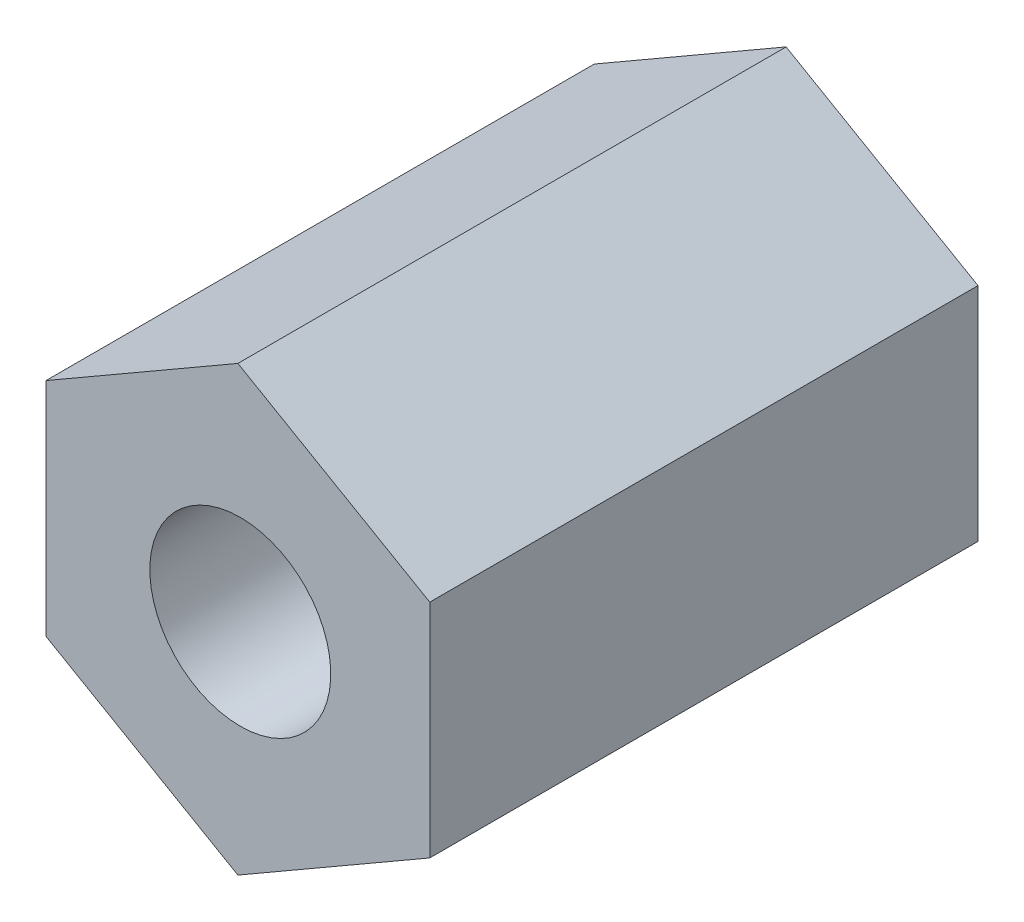
ISO-10303-21;
HEADER;
FILE_DESCRIPTION(('STEP AP214'),'2;1');
FILE_NAME('part.step','',(''),(''),'','','');
FILE_SCHEMA(('AUTOMOTIVE_DESIGN { 1 0 10303 214 1 1 1 1 }'));
ENDSEC;
DATA;
#1=APPLICATION_CONTEXT('core data for automotive mechanical design processes');
#2=APPLICATION_PROTOCOL_DEFINITION('international standard','automotive_design',2000,#1);
#3=PRODUCT_CONTEXT('',#1,'mechanical');
#4=PRODUCT('Part','Part','',(#3));
#5=PRODUCT_RELATED_PRODUCT_CATEGORY('part','',(#4));
#6=PRODUCT_DEFINITION_FORMATION('','',#4);
#7=PRODUCT_DEFINITION_CONTEXT('part definition',#1,'design');
#8=PRODUCT_DEFINITION('design','',#6,#7);
#9=PRODUCT_DEFINITION_SHAPE('','',#8);
#10=(LENGTH_UNIT() NAMED_UNIT(*) SI_UNIT(.MILLI.,.METRE.));
#11=(NAMED_UNIT(*) PLANE_ANGLE_UNIT() SI_UNIT($,.RADIAN.));
#12=(NAMED_UNIT(*) SI_UNIT($,.STERADIAN.) SOLID_ANGLE_UNIT());
#13=UNCERTAINTY_MEASURE_WITH_UNIT(LENGTH_MEASURE(1.E-05),#10,'distance_accuracy_value','');
#14=(GEOMETRIC_REPRESENTATION_CONTEXT(3) GLOBAL_UNCERTAINTY_ASSIGNED_CONTEXT((#13)) GLOBAL_UNIT_ASSIGNED_CONTEXT((#10,
#11,#12)) REPRESENTATION_CONTEXT('',''));
#15=CARTESIAN_POINT('',(0.,0.,0.));
#16=DIRECTION('',(0.,0.,1.));
#17=DIRECTION('',(1.,0.,0.));
#18=AXIS2_PLACEMENT_3D('',#15,#16,#17);
#19=CARTESIAN_POINT('',(-3.5,-4.089949307,0.));
#20=DIRECTION('',(0.,0.,1.));
#21=DIRECTION('',(1.,0.,0.));
#22=AXIS2_PLACEMENT_3D('',#19,#20,#21);
#23=PLANE('',#22);
#24=CARTESIAN_POINT('',(0.043884597,-0.0180420660000053,0.));
#25=DIRECTION('',(0.,0.,-1.));
#26=DIRECTION('',(0.,1.,0.));
#27=AXIS2_PLACEMENT_3D('',#24,#25,#26);
#28=CIRCLE('',#27,1.65);
#29=CARTESIAN_POINT('',(0.043884597,1.631957934,0.));
#30=VERTEX_POINT('',#29);
#31=EDGE_CURVE('E90',#30,#30,#28,.T.);
#32=ORIENTED_EDGE('',*,*,#31,.F.);
#33=EDGE_LOOP('',(#32));
#34=FACE_BOUND('',#33,.T.);
#35=DIRECTION('',(0.,1.,0.));
#36=VECTOR('',#35,1.);
#37=CARTESIAN_POINT('',(3.5,0.,0.));
#38=LINE('',#37,#36);
#39=CARTESIAN_POINT('',(3.5,-2.020725942,0.));
#40=VERTEX_POINT('',#39);
#41=CARTESIAN_POINT('',(3.5,2.020725942,0.));
#42=VERTEX_POINT('',#41);
#43=EDGE_CURVE('E139',#40,#42,#38,.T.);
#44=ORIENTED_EDGE('',*,*,#43,.F.);
#45=DIRECTION('',(0.866025403801977,0.499999999969623,0.));
#46=VECTOR('',#45,1.);
#47=CARTESIAN_POINT('',(3.5,-2.020725942,0.));
#48=LINE('',#47,#46);
#49=CARTESIAN_POINT('',(0.,-4.041451884,0.));
#50=VERTEX_POINT('',#49);
#51=EDGE_CURVE('E131',#50,#40,#48,.T.);
#52=ORIENTED_EDGE('',*,*,#51,.F.);
#53=DIRECTION('',(0.866025403801977,-0.499999999969623,0.));
#54=VECTOR('',#53,1.);
#55=CARTESIAN_POINT('',(0.,-4.041451884,0.));
#56=LINE('',#55,#54);
#57=CARTESIAN_POINT('',(-3.5,-2.020725942,0.));
#58=VERTEX_POINT('',#57);
#59=EDGE_CURVE('E125',#58,#50,#56,.T.);
#60=ORIENTED_EDGE('',*,*,#59,.F.);
#61=DIRECTION('',(0.,-1.,0.));
#62=VECTOR('',#61,1.);
#63=CARTESIAN_POINT('',(-3.5,0.,0.));
#64=LINE('',#63,#62);
#65=CARTESIAN_POINT('',(-3.5,2.020725942,0.));
#66=VERTEX_POINT('',#65);
#67=EDGE_CURVE('E116',#66,#58,#64,.T.);
#68=ORIENTED_EDGE('',*,*,#67,.F.);
#69=DIRECTION('',(-0.866025403801977,-0.499999999969623,0.));
#70=VECTOR('',#69,1.);
#71=CARTESIAN_POINT('',(-3.5,2.020725942,0.));
#72=LINE('',#71,#70);
#73=CARTESIAN_POINT('',(0.,4.041451884,0.));
#74=VERTEX_POINT('',#73);
#75=EDGE_CURVE('E112',#74,#66,#72,.T.);
#76=ORIENTED_EDGE('',*,*,#75,.F.);
#77=DIRECTION('',(-0.866025403801977,0.499999999969623,0.));
#78=VECTOR('',#77,1.);
#79=CARTESIAN_POINT('',(0.,4.041451884,0.));
#80=LINE('',#79,#78);
#81=EDGE_CURVE('E11',#42,#74,#80,.T.);
#82=ORIENTED_EDGE('',*,*,#81,.F.);
#83=EDGE_LOOP('',(#44,#52,#60,#68,#76,#82));
#84=FACE_BOUND('',#83,.T.);
#85=ADVANCED_FACE('F16',(#34,#84),#23,.F.);
#86=CARTESIAN_POINT('',(-3.5,-4.089949307,10.));
#87=DIRECTION('',(0.,0.,1.));
#88=DIRECTION('',(1.,0.,0.));
#89=AXIS2_PLACEMENT_3D('',#86,#87,#88);
#90=PLANE('',#89);
#91=CARTESIAN_POINT('',(0.043884597,-0.018042066,10.));
#92=DIRECTION('',(0.,0.,1.));
#93=DIRECTION('',(0.,1.,0.));
#94=AXIS2_PLACEMENT_3D('',#91,#92,#93);
#95=CIRCLE('',#94,1.65);
#96=CARTESIAN_POINT('',(0.0438845970000002,-1.668042066,10.));
#97=VERTEX_POINT('',#96);
#98=EDGE_CURVE('E96',#97,#97,#95,.T.);
#99=ORIENTED_EDGE('',*,*,#98,.F.);
#100=EDGE_LOOP('',(#99));
#101=FACE_BOUND('',#100,.T.);
#102=DIRECTION('',(0.866025403888613,0.499999999819565,0.));
#103=VECTOR('',#102,1.);
#104=CARTESIAN_POINT('',(0.,-4.04145188238279,10.));
#105=LINE('',#104,#103);
#106=CARTESIAN_POINT('',(1.75067886619765E-10,-4.04145188288817,10.));
#107=VERTEX_POINT('',#106);
#108=CARTESIAN_POINT('',(3.5,-2.0207259415957,10.));
#109=VERTEX_POINT('',#108);
#110=EDGE_CURVE('E20',#107,#109,#105,.T.);
#111=ORIENTED_EDGE('',*,*,#110,.T.);
#112=DIRECTION('',(0.,1.,0.));
#113=VECTOR('',#112,1.);
#114=CARTESIAN_POINT('',(3.5,0.,10.));
#115=LINE('',#114,#113);
#116=CARTESIAN_POINT('',(3.5,2.0207259415957,10.));
#117=VERTEX_POINT('',#116);
#118=EDGE_CURVE('E142',#109,#117,#115,.T.);
#119=ORIENTED_EDGE('',*,*,#118,.T.);
#120=DIRECTION('',(-0.866025403888613,0.499999999819565,0.));
#121=VECTOR('',#120,1.);
#122=CARTESIAN_POINT('',(3.5,2.0207259411914,10.));
#123=LINE('',#122,#121);
#124=CARTESIAN_POINT('',(-1.7506766977933E-10,4.04145188288817,10.));
#125=VERTEX_POINT('',#124);
#126=EDGE_CURVE('E27',#117,#125,#123,.T.);
#127=ORIENTED_EDGE('',*,*,#126,.T.);
#128=DIRECTION('',(-0.866025403888613,-0.499999999819565,0.));
#129=VECTOR('',#128,1.);
#130=CARTESIAN_POINT('',(0.,4.04145188238279,10.));
#131=LINE('',#130,#129);
#132=CARTESIAN_POINT('',(-3.5,2.0207259415957,10.));
#133=VERTEX_POINT('',#132);
#134=EDGE_CURVE('E103',#125,#133,#131,.T.);
#135=ORIENTED_EDGE('',*,*,#134,.T.);
#136=DIRECTION('',(0.,-1.,0.));
#137=VECTOR('',#136,1.);
#138=CARTESIAN_POINT('',(-3.5,0.,10.));
#139=LINE('',#138,#137);
#140=CARTESIAN_POINT('',(-3.5,-2.0207259415957,10.));
#141=VERTEX_POINT('',#140);
#142=EDGE_CURVE('E111',#133,#141,#139,.T.);
#143=ORIENTED_EDGE('',*,*,#142,.T.);
#144=DIRECTION('',(0.866025403888613,-0.499999999819565,0.));
#145=VECTOR('',#144,1.);
#146=CARTESIAN_POINT('',(-3.5,-2.02072594119139,10.));
#147=LINE('',#146,#145);
#148=EDGE_CURVE('E126',#141,#107,#147,.T.);
#149=ORIENTED_EDGE('',*,*,#148,.T.);
#150=EDGE_LOOP('',(#111,#119,#127,#135,#143,#149));
#151=FACE_BOUND('',#150,.T.);
#152=ADVANCED_FACE('F166',(#101,#151),#90,.T.);
#153=CARTESIAN_POINT('',(0.,4.041451884,0.));
#154=DIRECTION('',(-0.499999999969623,-0.866025403801977,0.));
#155=DIRECTION('',(-0.866025403801977,0.499999999969623,0.));
#156=AXIS2_PLACEMENT_3D('',#153,#154,#155);
#157=PLANE('',#156);
#158=DIRECTION('',(0.,0.,-1.));
#159=VECTOR('',#158,1.);
#160=CARTESIAN_POINT('',(0.,4.041451884,5.));
#161=LINE('',#160,#159);
#162=EDGE_CURVE('E120',#125,#74,#161,.T.);
#163=ORIENTED_EDGE('',*,*,#162,.F.);
#164=ORIENTED_EDGE('',*,*,#126,.F.);
#165=DIRECTION('',(0.,0.,1.));
#166=VECTOR('',#165,1.);
#167=CARTESIAN_POINT('',(3.5,2.020725942,5.));
#168=LINE('',#167,#166);
#169=EDGE_CURVE('E134',#42,#117,#168,.T.);
#170=ORIENTED_EDGE('',*,*,#169,.F.);
#171=ORIENTED_EDGE('',*,*,#81,.T.);
#172=EDGE_LOOP('',(#163,#164,#170,#171));
#173=FACE_BOUND('',#172,.T.);
#174=ADVANCED_FACE('F18',(#173),#157,.F.);
#175=CARTESIAN_POINT('',(3.5,2.020725942,0.));
#176=DIRECTION('',(-1.,0.,0.));
#177=DIRECTION('',(0.,0.,1.));
#178=AXIS2_PLACEMENT_3D('',#175,#176,#177);
#179=PLANE('',#178);
#180=ORIENTED_EDGE('',*,*,#169,.T.);
#181=ORIENTED_EDGE('',*,*,#118,.F.);
#182=DIRECTION('',(0.,0.,1.));
#183=VECTOR('',#182,1.);
#184=CARTESIAN_POINT('',(3.5,-2.020725942,5.));
#185=LINE('',#184,#183);
#186=EDGE_CURVE('E121',#40,#109,#185,.T.);
#187=ORIENTED_EDGE('',*,*,#186,.F.);
#188=ORIENTED_EDGE('',*,*,#43,.T.);
#189=EDGE_LOOP('',(#180,#181,#187,#188));
#190=FACE_BOUND('',#189,.T.);
#191=ADVANCED_FACE('F203',(#190),#179,.F.);
#192=CARTESIAN_POINT('',(3.5,-2.020725942,0.));
#193=DIRECTION('',(-0.499999999969623,0.866025403801977,0.));
#194=DIRECTION('',(0.,0.,1.));
#195=AXIS2_PLACEMENT_3D('',#192,#193,#194);
#196=PLANE('',#195);
#197=ORIENTED_EDGE('',*,*,#186,.T.);
#198=ORIENTED_EDGE('',*,*,#110,.F.);
#199=DIRECTION('',(0.,0.,1.));
#200=VECTOR('',#199,1.);
#201=CARTESIAN_POINT('',(0.,-4.041451884,5.));
#202=LINE('',#201,#200);
#203=EDGE_CURVE('E130',#50,#107,#202,.T.);
#204=ORIENTED_EDGE('',*,*,#203,.F.);
#205=ORIENTED_EDGE('',*,*,#51,.T.);
#206=EDGE_LOOP('',(#197,#198,#204,#205));
#207=FACE_BOUND('',#206,.T.);
#208=ADVANCED_FACE('F179',(#207),#196,.F.);
#209=CARTESIAN_POINT('',(0.,-4.041451884,0.));
#210=DIRECTION('',(0.499999999969623,0.866025403801977,0.));
#211=DIRECTION('',(0.,0.,-1.));
#212=AXIS2_PLACEMENT_3D('',#209,#210,#211);
#213=PLANE('',#212);
#214=ORIENTED_EDGE('',*,*,#203,.T.);
#215=ORIENTED_EDGE('',*,*,#148,.F.);
#216=DIRECTION('',(0.,0.,1.));
#217=VECTOR('',#216,1.);
#218=CARTESIAN_POINT('',(-3.5,-2.020725942,5.));
#219=LINE('',#218,#217);
#220=EDGE_CURVE('E108',#58,#141,#219,.T.);
#221=ORIENTED_EDGE('',*,*,#220,.F.);
#222=ORIENTED_EDGE('',*,*,#59,.T.);
#223=EDGE_LOOP('',(#214,#215,#221,#222));
#224=FACE_BOUND('',#223,.T.);
#225=ADVANCED_FACE('F177',(#224),#213,.F.);
#226=CARTESIAN_POINT('',(-3.5,-2.020725942,10.));
#227=DIRECTION('',(1.,0.,0.));
#228=DIRECTION('',(0.,1.,0.));
#229=AXIS2_PLACEMENT_3D('',#226,#227,#228);
#230=PLANE('',#229);
#231=ORIENTED_EDGE('',*,*,#220,.T.);
#232=ORIENTED_EDGE('',*,*,#142,.F.);
#233=DIRECTION('',(0.,0.,1.));
#234=VECTOR('',#233,1.);
#235=CARTESIAN_POINT('',(-3.5,2.020725942,5.));
#236=LINE('',#235,#234);
#237=EDGE_CURVE('E95',#66,#133,#236,.T.);
#238=ORIENTED_EDGE('',*,*,#237,.F.);
#239=ORIENTED_EDGE('',*,*,#67,.T.);
#240=EDGE_LOOP('',(#231,#232,#238,#239));
#241=FACE_BOUND('',#240,.T.);
#242=ADVANCED_FACE('F173',(#241),#230,.F.);
#243=CARTESIAN_POINT('',(-3.5,2.020725942,0.));
#244=DIRECTION('',(0.499999999969623,-0.866025403801977,0.));
#245=DIRECTION('',(0.,0.,-1.));
#246=AXIS2_PLACEMENT_3D('',#243,#244,#245);
#247=PLANE('',#246);
#248=ORIENTED_EDGE('',*,*,#237,.T.);
#249=ORIENTED_EDGE('',*,*,#134,.F.);
#250=ORIENTED_EDGE('',*,*,#162,.T.);
#251=ORIENTED_EDGE('',*,*,#75,.T.);
#252=EDGE_LOOP('',(#248,#249,#250,#251));
#253=FACE_BOUND('',#252,.T.);
#254=ADVANCED_FACE('F170',(#253),#247,.F.);
#255=CARTESIAN_POINT('',(0.043884597,-0.018042066,10.));
#256=DIRECTION('',(0.,0.,-1.));
#257=DIRECTION('',(0.,1.,0.));
#258=AXIS2_PLACEMENT_3D('',#255,#256,#257);
#259=CYLINDRICAL_SURFACE('',#258,1.65);
#260=ORIENTED_EDGE('',*,*,#31,.T.);
#261=EDGE_LOOP('',(#260));
#262=FACE_BOUND('',#261,.T.);
#263=ORIENTED_EDGE('',*,*,#98,.T.);
#264=EDGE_LOOP('',(#263));
#265=FACE_BOUND('',#264,.T.);
#266=ADVANCED_FACE('F91',(#262,#265),#259,.F.);
#267=CLOSED_SHELL('',(#85,#152,#174,#191,#208,#225,#242,#254,#266));
#268=MANIFOLD_SOLID_BREP('B1',#267);
#269=ADVANCED_BREP_SHAPE_REPRESENTATION('',(#18,#268),#14);
#270=SHAPE_DEFINITION_REPRESENTATION(#9,#269);
ENDSEC;
END-ISO-10303-21;
